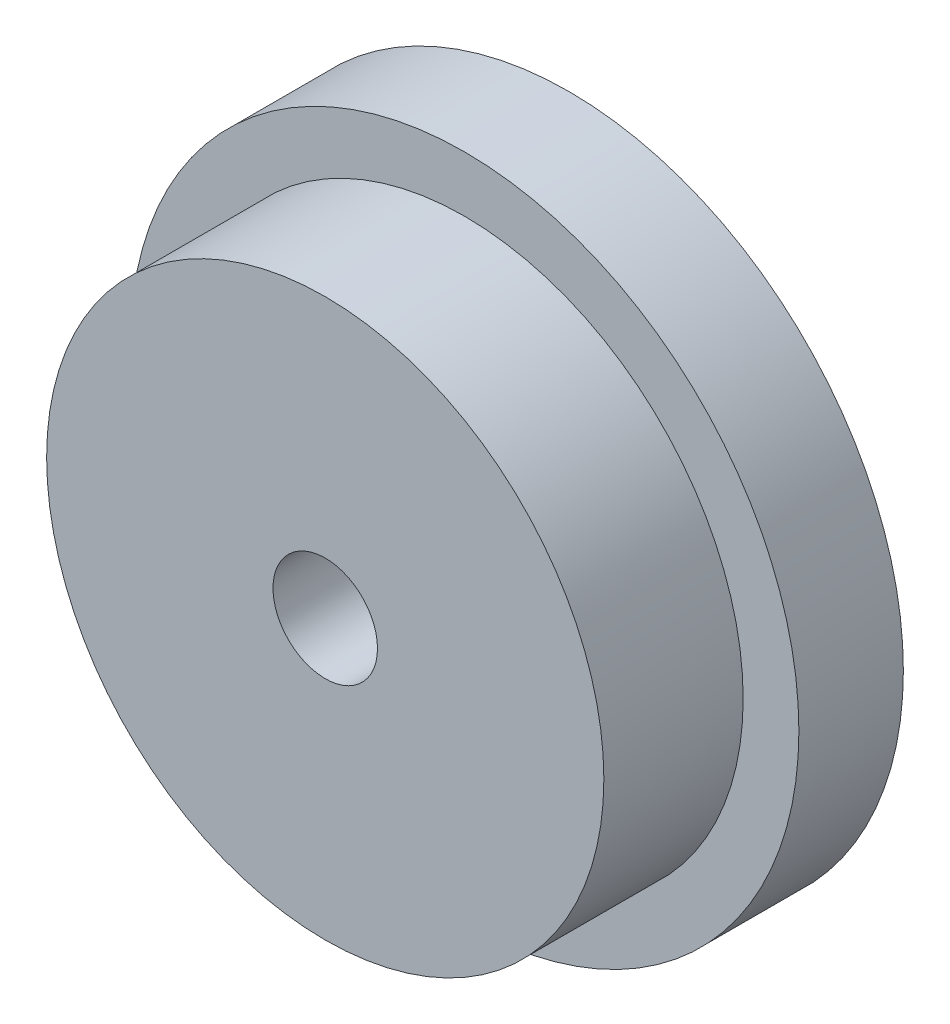
ISO-10303-21;
HEADER;
FILE_DESCRIPTION(('STEP AP214'),'2;1');
FILE_NAME('part.step','',(''),(''),'','','');
FILE_SCHEMA(('AUTOMOTIVE_DESIGN { 1 0 10303 214 1 1 1 1 }'));
ENDSEC;
DATA;
#1=APPLICATION_CONTEXT('core data for automotive mechanical design processes');
#2=APPLICATION_PROTOCOL_DEFINITION('international standard','automotive_design',2000,#1);
#3=PRODUCT_CONTEXT('',#1,'mechanical');
#4=PRODUCT('Part','Part','',(#3));
#5=PRODUCT_RELATED_PRODUCT_CATEGORY('part','',(#4));
#6=PRODUCT_DEFINITION_FORMATION('','',#4);
#7=PRODUCT_DEFINITION_CONTEXT('part definition',#1,'design');
#8=PRODUCT_DEFINITION('design','',#6,#7);
#9=PRODUCT_DEFINITION_SHAPE('','',#8);
#10=(LENGTH_UNIT() NAMED_UNIT(*) SI_UNIT(.MILLI.,.METRE.));
#11=(NAMED_UNIT(*) PLANE_ANGLE_UNIT() SI_UNIT($,.RADIAN.));
#12=(NAMED_UNIT(*) SI_UNIT($,.STERADIAN.) SOLID_ANGLE_UNIT());
#13=UNCERTAINTY_MEASURE_WITH_UNIT(LENGTH_MEASURE(1.E-05),#10,'distance_accuracy_value','');
#14=(GEOMETRIC_REPRESENTATION_CONTEXT(3) GLOBAL_UNCERTAINTY_ASSIGNED_CONTEXT((#13)) GLOBAL_UNIT_ASSIGNED_CONTEXT((#10,
#11,#12)) REPRESENTATION_CONTEXT('',''));
#15=CARTESIAN_POINT('',(0.,0.,0.));
#16=DIRECTION('',(0.,0.,1.));
#17=DIRECTION('',(1.,0.,0.));
#18=AXIS2_PLACEMENT_3D('',#15,#16,#17);
#19=CARTESIAN_POINT('',(0.,0.,9.525));
#20=DIRECTION('',(0.,0.,1.));
#21=DIRECTION('',(1.,0.,0.));
#22=AXIS2_PLACEMENT_3D('',#19,#20,#21);
#23=PLANE('',#22);
#24=CARTESIAN_POINT('',(0.,0.,9.525));
#25=DIRECTION('',(0.,0.,1.));
#26=DIRECTION('',(1.,0.,0.));
#27=AXIS2_PLACEMENT_3D('',#24,#25,#26);
#28=CIRCLE('',#27,30.48);
#29=CARTESIAN_POINT('',(-30.48,0.,9.525));
#30=VERTEX_POINT('',#29);
#31=EDGE_CURVE('E10',#30,#30,#28,.T.);
#32=ORIENTED_EDGE('',*,*,#31,.T.);
#33=EDGE_LOOP('',(#32));
#34=FACE_BOUND('',#33,.T.);
#35=CARTESIAN_POINT('',(0.,0.,9.525));
#36=DIRECTION('',(0.,0.,1.));
#37=DIRECTION('',(1.,0.,0.));
#38=AXIS2_PLACEMENT_3D('',#35,#36,#37);
#39=CIRCLE('',#38,25.4);
#40=CARTESIAN_POINT('',(25.4,0.,9.525));
#41=VERTEX_POINT('',#40);
#42=EDGE_CURVE('E48',#41,#41,#39,.T.);
#43=ORIENTED_EDGE('',*,*,#42,.F.);
#44=EDGE_LOOP('',(#43));
#45=FACE_BOUND('',#44,.T.);
#46=ADVANCED_FACE('F35',(#34,#45),#23,.T.);
#47=CARTESIAN_POINT('',(0.,0.,9.525));
#48=DIRECTION('',(0.,0.,-1.));
#49=DIRECTION('',(-1.,0.,0.));
#50=AXIS2_PLACEMENT_3D('',#47,#48,#49);
#51=CYLINDRICAL_SURFACE('',#50,30.48);
#52=CARTESIAN_POINT('',(0.,0.,0.));
#53=DIRECTION('',(0.,0.,1.));
#54=DIRECTION('',(1.,0.,0.));
#55=AXIS2_PLACEMENT_3D('',#52,#53,#54);
#56=CIRCLE('',#55,30.48);
#57=CARTESIAN_POINT('',(-30.48,0.,0.));
#58=VERTEX_POINT('',#57);
#59=EDGE_CURVE('E39',#58,#58,#56,.T.);
#60=CARTESIAN_POINT('',(-30.48,0.,9.525));
#61=CARTESIAN_POINT('',(-30.48,0.,9.42578125));
#62=CARTESIAN_POINT('',(-30.48,0.,9.3265625));
#63=CARTESIAN_POINT('',(-30.48,0.,9.128125));
#64=CARTESIAN_POINT('',(-30.48,0.,9.02890625));
#65=CARTESIAN_POINT('',(-30.48,0.,8.83046875));
#66=CARTESIAN_POINT('',(-30.48,0.,8.73125));
#67=CARTESIAN_POINT('',(-30.48,0.,8.5328125));
#68=CARTESIAN_POINT('',(-30.48,0.,8.43359375));
#69=CARTESIAN_POINT('',(-30.48,0.,8.23515625));
#70=CARTESIAN_POINT('',(-30.48,0.,8.1359375));
#71=CARTESIAN_POINT('',(-30.48,0.,7.9375));
#72=CARTESIAN_POINT('',(-30.48,0.,7.83828125));
#73=CARTESIAN_POINT('',(-30.48,0.,7.63984375));
#74=CARTESIAN_POINT('',(-30.48,0.,7.540625));
#75=CARTESIAN_POINT('',(-30.48,0.,7.3421875));
#76=CARTESIAN_POINT('',(-30.48,0.,7.24296875));
#77=CARTESIAN_POINT('',(-30.48,0.,7.04453125));
#78=CARTESIAN_POINT('',(-30.48,0.,6.9453125));
#79=CARTESIAN_POINT('',(-30.48,0.,6.746875));
#80=CARTESIAN_POINT('',(-30.48,0.,6.64765625));
#81=CARTESIAN_POINT('',(-30.48,0.,6.44921875));
#82=CARTESIAN_POINT('',(-30.48,0.,6.35));
#83=CARTESIAN_POINT('',(-30.48,0.,6.1515625));
#84=CARTESIAN_POINT('',(-30.48,0.,6.05234375));
#85=CARTESIAN_POINT('',(-30.48,0.,5.85390625));
#86=CARTESIAN_POINT('',(-30.48,0.,5.7546875));
#87=CARTESIAN_POINT('',(-30.48,0.,5.55625));
#88=CARTESIAN_POINT('',(-30.48,0.,5.45703125));
#89=CARTESIAN_POINT('',(-30.48,0.,5.25859375));
#90=CARTESIAN_POINT('',(-30.48,0.,5.159375));
#91=CARTESIAN_POINT('',(-30.48,0.,4.9609375));
#92=CARTESIAN_POINT('',(-30.48,0.,4.86171875));
#93=CARTESIAN_POINT('',(-30.48,0.,4.66328125));
#94=CARTESIAN_POINT('',(-30.48,0.,4.5640625));
#95=CARTESIAN_POINT('',(-30.48,0.,4.365625));
#96=CARTESIAN_POINT('',(-30.48,0.,4.26640625));
#97=CARTESIAN_POINT('',(-30.48,0.,4.06796875));
#98=CARTESIAN_POINT('',(-30.48,0.,3.96875));
#99=CARTESIAN_POINT('',(-30.48,0.,3.7703125));
#100=CARTESIAN_POINT('',(-30.48,0.,3.67109375));
#101=CARTESIAN_POINT('',(-30.48,0.,3.47265625));
#102=CARTESIAN_POINT('',(-30.48,0.,3.3734375));
#103=CARTESIAN_POINT('',(-30.48,0.,3.175));
#104=CARTESIAN_POINT('',(-30.48,0.,3.07578125));
#105=CARTESIAN_POINT('',(-30.48,0.,2.87734375));
#106=CARTESIAN_POINT('',(-30.48,0.,2.778125));
#107=CARTESIAN_POINT('',(-30.48,0.,2.5796875));
#108=CARTESIAN_POINT('',(-30.48,0.,2.48046875));
#109=CARTESIAN_POINT('',(-30.48,0.,2.28203125));
#110=CARTESIAN_POINT('',(-30.48,0.,2.1828125));
#111=CARTESIAN_POINT('',(-30.48,0.,1.984375));
#112=CARTESIAN_POINT('',(-30.48,0.,1.88515625));
#113=CARTESIAN_POINT('',(-30.48,0.,1.68671875));
#114=CARTESIAN_POINT('',(-30.48,0.,1.5875));
#115=CARTESIAN_POINT('',(-30.48,0.,1.3890625));
#116=CARTESIAN_POINT('',(-30.48,0.,1.28984375));
#117=CARTESIAN_POINT('',(-30.48,0.,1.09140625));
#118=CARTESIAN_POINT('',(-30.48,0.,0.992187500000001));
#119=CARTESIAN_POINT('',(-30.48,0.,0.793750000000001));
#120=CARTESIAN_POINT('',(-30.48,0.,0.69453125));
#121=CARTESIAN_POINT('',(-30.48,0.,0.49609375));
#122=CARTESIAN_POINT('',(-30.48,0.,0.396875));
#123=CARTESIAN_POINT('',(-30.48,0.,0.1984375));
#124=CARTESIAN_POINT('',(-30.48,0.,0.0992187500000001));
#125=CARTESIAN_POINT('',(-30.48,0.,0.));
#126=B_SPLINE_CURVE_WITH_KNOTS('',3,(#60,#61,#62,#63,#64,#65,#66,#67,#68,#69,#70,#71,#72,#73,
#74,#75,#76,#77,#78,#79,#80,#81,#82,#83,#84,#85,#86,#87,#88,#89,#90,#91,#92,#93,#94,#95,#96,#97,
#98,#99,#100,#101,#102,#103,#104,#105,#106,#107,#108,#109,#110,#111,#112,#113,#114,#115,#116,
#117,#118,#119,#120,#121,#122,#123,#124,#125),.UNSPECIFIED.,.F.,.F.,(4,2,2,2,2,2,2,2,2,2,2,2,2,
2,2,2,2,2,2,2,2,2,2,2,2,2,2,2,2,2,2,2,4),(0.,0.297656249999998,0.595312499999999,
0.892968749999999,1.190625,1.48828125,1.7859375,2.08359375,2.38125,2.67890625,2.9765625,
3.27421875,3.571875,3.86953125,4.1671875,4.46484375,4.7625,5.06015625,5.3578125,5.65546875,
5.953125,6.25078125,6.5484375,6.84609375,7.14375,7.44140625,7.7390625,8.03671875,8.334375,
8.63203125,8.9296875,9.22734375,9.525),.UNSPECIFIED.);
#127=EDGE_CURVE('BSEAM37',#30,#58,#126,.T.);
#128=ORIENTED_EDGE('',*,*,#31,.F.);
#129=ORIENTED_EDGE('',*,*,#59,.T.);
#130=ORIENTED_EDGE('',*,*,#127,.T.);
#131=ORIENTED_EDGE('',*,*,#127,.F.);
#132=EDGE_LOOP('',(#128,#130,#129,#131));
#133=FACE_BOUND('',#132,.T.);
#134=ADVANCED_FACE('F37',(#133),#51,.T.);
#135=CARTESIAN_POINT('',(0.,0.,0.));
#136=DIRECTION('',(0.,0.,1.));
#137=DIRECTION('',(1.,0.,0.));
#138=AXIS2_PLACEMENT_3D('',#135,#136,#137);
#139=PLANE('',#138);
#140=CARTESIAN_POINT('',(0.,0.,0.));
#141=DIRECTION('',(0.,0.,1.));
#142=DIRECTION('',(1.,0.,0.));
#143=AXIS2_PLACEMENT_3D('',#140,#141,#142);
#144=CIRCLE('',#143,4.7625);
#145=CARTESIAN_POINT('',(4.7625,0.,0.));
#146=VERTEX_POINT('',#145);
#147=EDGE_CURVE('E51',#146,#146,#144,.T.);
#148=ORIENTED_EDGE('',*,*,#147,.T.);
#149=EDGE_LOOP('',(#148));
#150=FACE_BOUND('',#149,.T.);
#151=ORIENTED_EDGE('',*,*,#59,.F.);
#152=EDGE_LOOP('',(#151));
#153=FACE_BOUND('',#152,.T.);
#154=ADVANCED_FACE('F60',(#150,#153),#139,.F.);
#155=CARTESIAN_POINT('',(0.,0.,22.225));
#156=DIRECTION('',(0.,0.,-1.));
#157=DIRECTION('',(-1.,0.,0.));
#158=AXIS2_PLACEMENT_3D('',#155,#156,#157);
#159=CYLINDRICAL_SURFACE('',#158,25.4);
#160=CARTESIAN_POINT('',(0.,0.,22.225));
#161=DIRECTION('',(0.,0.,1.));
#162=DIRECTION('',(1.,0.,0.));
#163=AXIS2_PLACEMENT_3D('',#160,#161,#162);
#164=CIRCLE('',#163,25.4);
#165=CARTESIAN_POINT('',(25.4,0.,22.225));
#166=VERTEX_POINT('',#165);
#167=EDGE_CURVE('E46',#166,#166,#164,.T.);
#168=ORIENTED_EDGE('',*,*,#167,.F.);
#169=EDGE_LOOP('',(#168));
#170=FACE_BOUND('',#169,.T.);
#171=ORIENTED_EDGE('',*,*,#42,.T.);
#172=EDGE_LOOP('',(#171));
#173=FACE_BOUND('',#172,.T.);
#174=ADVANCED_FACE('F72',(#170,#173),#159,.T.);
#175=CARTESIAN_POINT('',(0.,0.,22.225));
#176=DIRECTION('',(0.,0.,1.));
#177=DIRECTION('',(1.,0.,0.));
#178=AXIS2_PLACEMENT_3D('',#175,#176,#177);
#179=PLANE('',#178);
#180=CARTESIAN_POINT('',(0.,0.,22.225));
#181=DIRECTION('',(0.,0.,1.));
#182=DIRECTION('',(1.,0.,0.));
#183=AXIS2_PLACEMENT_3D('',#180,#181,#182);
#184=CIRCLE('',#183,4.7625);
#185=CARTESIAN_POINT('',(4.7625,0.,22.225));
#186=VERTEX_POINT('',#185);
#187=EDGE_CURVE('E54',#186,#186,#184,.T.);
#188=ORIENTED_EDGE('',*,*,#187,.F.);
#189=EDGE_LOOP('',(#188));
#190=FACE_BOUND('',#189,.T.);
#191=ORIENTED_EDGE('',*,*,#167,.T.);
#192=EDGE_LOOP('',(#191));
#193=FACE_BOUND('',#192,.T.);
#194=ADVANCED_FACE('F66',(#190,#193),#179,.T.);
#195=CARTESIAN_POINT('',(0.,0.,0.));
#196=DIRECTION('',(0.,0.,1.));
#197=DIRECTION('',(1.,0.,0.));
#198=AXIS2_PLACEMENT_3D('',#195,#196,#197);
#199=CYLINDRICAL_SURFACE('',#198,4.7625);
#200=ORIENTED_EDGE('',*,*,#147,.F.);
#201=EDGE_LOOP('',(#200));
#202=FACE_BOUND('',#201,.T.);
#203=ORIENTED_EDGE('',*,*,#187,.T.);
#204=EDGE_LOOP('',(#203));
#205=FACE_BOUND('',#204,.T.);
#206=ADVANCED_FACE('F63',(#202,#205),#199,.F.);
#207=CLOSED_SHELL('',(#46,#134,#154,#174,#194,#206));
#208=MANIFOLD_SOLID_BREP('B2',#207);
#209=ADVANCED_BREP_SHAPE_REPRESENTATION('',(#18,#208),#14);
#210=SHAPE_DEFINITION_REPRESENTATION(#9,#209);
ENDSEC;
END-ISO-10303-21;
